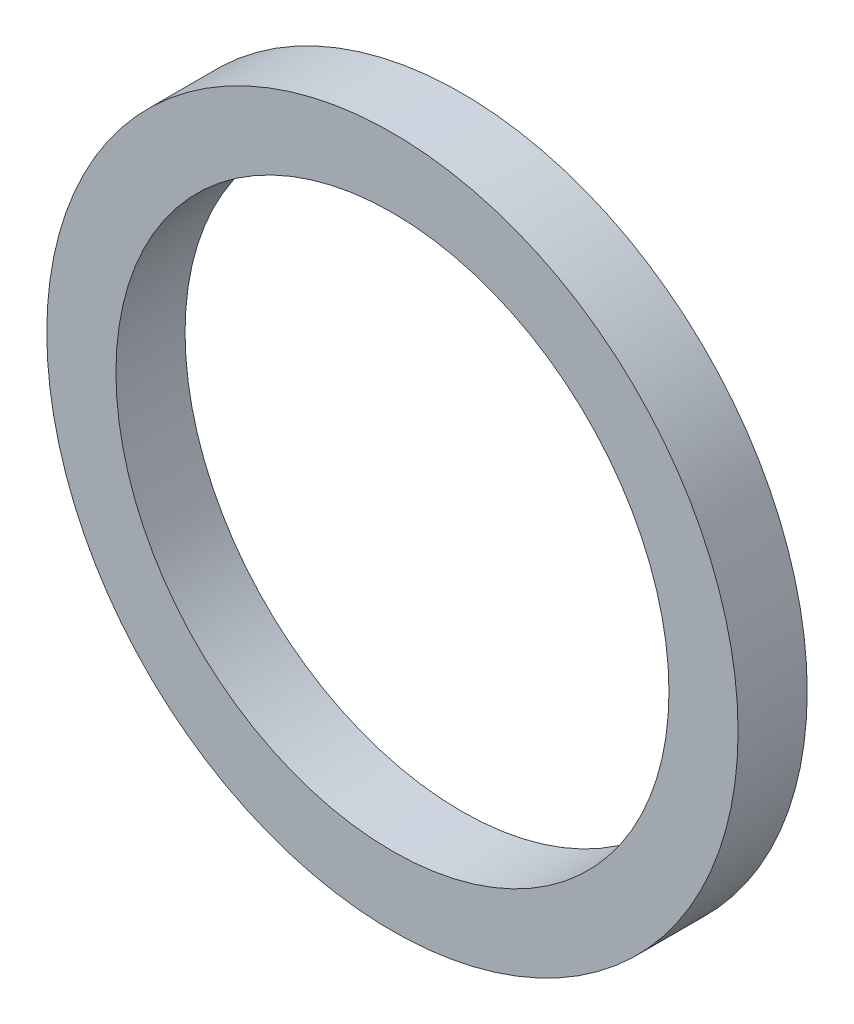
ISO-10303-21;
HEADER;
FILE_DESCRIPTION(('STEP AP214'),'2;1');
FILE_NAME('part.step','',(''),(''),'','','');
FILE_SCHEMA(('AUTOMOTIVE_DESIGN { 1 0 10303 214 1 1 1 1 }'));
ENDSEC;
DATA;
#1=APPLICATION_CONTEXT('core data for automotive mechanical design processes');
#2=APPLICATION_PROTOCOL_DEFINITION('international standard','automotive_design',2000,#1);
#3=PRODUCT_CONTEXT('',#1,'mechanical');
#4=PRODUCT('Part','Part','',(#3));
#5=PRODUCT_RELATED_PRODUCT_CATEGORY('part','',(#4));
#6=PRODUCT_DEFINITION_FORMATION('','',#4);
#7=PRODUCT_DEFINITION_CONTEXT('part definition',#1,'design');
#8=PRODUCT_DEFINITION('design','',#6,#7);
#9=PRODUCT_DEFINITION_SHAPE('','',#8);
#10=(LENGTH_UNIT() NAMED_UNIT(*) SI_UNIT(.MILLI.,.METRE.));
#11=(NAMED_UNIT(*) PLANE_ANGLE_UNIT() SI_UNIT($,.RADIAN.));
#12=(NAMED_UNIT(*) SI_UNIT($,.STERADIAN.) SOLID_ANGLE_UNIT());
#13=UNCERTAINTY_MEASURE_WITH_UNIT(LENGTH_MEASURE(1.E-05),#10,'distance_accuracy_value','');
#14=(GEOMETRIC_REPRESENTATION_CONTEXT(3) GLOBAL_UNCERTAINTY_ASSIGNED_CONTEXT((#13)) GLOBAL_UNIT_ASSIGNED_CONTEXT((#10,
#11,#12)) REPRESENTATION_CONTEXT('',''));
#15=CARTESIAN_POINT('',(0.,0.,0.));
#16=DIRECTION('',(0.,0.,1.));
#17=DIRECTION('',(1.,0.,0.));
#18=AXIS2_PLACEMENT_3D('',#15,#16,#17);
#19=CARTESIAN_POINT('',(0.,0.,15.));
#20=DIRECTION('',(0.,0.,1.));
#21=DIRECTION('',(1.,0.,0.));
#22=AXIS2_PLACEMENT_3D('',#19,#20,#21);
#23=PLANE('',#22);
#24=CARTESIAN_POINT('',(0.,0.,15.));
#25=DIRECTION('',(0.,0.,1.));
#26=DIRECTION('',(1.,0.,0.));
#27=AXIS2_PLACEMENT_3D('',#24,#25,#26);
#28=CIRCLE('',#27,75.);
#29=CARTESIAN_POINT('',(75.,0.,15.));
#30=VERTEX_POINT('',#29);
#31=EDGE_CURVE('E10',#30,#30,#28,.T.);
#32=ORIENTED_EDGE('',*,*,#31,.T.);
#33=EDGE_LOOP('',(#32));
#34=FACE_BOUND('',#33,.T.);
#35=CARTESIAN_POINT('',(0.,0.,15.));
#36=DIRECTION('',(0.,0.,1.));
#37=DIRECTION('',(1.,0.,0.));
#38=AXIS2_PLACEMENT_3D('',#35,#36,#37);
#39=CIRCLE('',#38,60.);
#40=CARTESIAN_POINT('',(60.,0.,15.));
#41=VERTEX_POINT('',#40);
#42=EDGE_CURVE('E50',#41,#41,#39,.T.);
#43=ORIENTED_EDGE('',*,*,#42,.F.);
#44=EDGE_LOOP('',(#43));
#45=FACE_BOUND('',#44,.T.);
#46=ADVANCED_FACE('F39',(#34,#45),#23,.T.);
#47=CARTESIAN_POINT('',(0.,0.,0.));
#48=DIRECTION('',(0.,0.,1.));
#49=DIRECTION('',(1.,0.,0.));
#50=AXIS2_PLACEMENT_3D('',#47,#48,#49);
#51=PLANE('',#50);
#52=CARTESIAN_POINT('',(0.,0.,0.));
#53=DIRECTION('',(0.,0.,1.));
#54=DIRECTION('',(1.,0.,0.));
#55=AXIS2_PLACEMENT_3D('',#52,#53,#54);
#56=CIRCLE('',#55,75.);
#57=CARTESIAN_POINT('',(75.,0.,0.));
#58=VERTEX_POINT('',#57);
#59=EDGE_CURVE('E43',#58,#58,#56,.T.);
#60=ORIENTED_EDGE('',*,*,#59,.F.);
#61=EDGE_LOOP('',(#60));
#62=FACE_BOUND('',#61,.T.);
#63=CARTESIAN_POINT('',(0.,0.,0.));
#64=DIRECTION('',(0.,0.,1.));
#65=DIRECTION('',(1.,0.,0.));
#66=AXIS2_PLACEMENT_3D('',#63,#64,#65);
#67=CIRCLE('',#66,60.);
#68=CARTESIAN_POINT('',(60.,0.,0.));
#69=VERTEX_POINT('',#68);
#70=EDGE_CURVE('E52',#69,#69,#67,.T.);
#71=ORIENTED_EDGE('',*,*,#70,.T.);
#72=EDGE_LOOP('',(#71));
#73=FACE_BOUND('',#72,.T.);
#74=ADVANCED_FACE('F62',(#62,#73),#51,.F.);
#75=CARTESIAN_POINT('',(0.,0.,15.));
#76=DIRECTION('',(0.,0.,-1.));
#77=DIRECTION('',(-1.,0.,0.));
#78=AXIS2_PLACEMENT_3D('',#75,#76,#77);
#79=CYLINDRICAL_SURFACE('',#78,75.);
#80=ORIENTED_EDGE('',*,*,#31,.F.);
#81=EDGE_LOOP('',(#80));
#82=FACE_BOUND('',#81,.T.);
#83=ORIENTED_EDGE('',*,*,#59,.T.);
#84=EDGE_LOOP('',(#83));
#85=FACE_BOUND('',#84,.T.);
#86=ADVANCED_FACE('F41',(#82,#85),#79,.T.);
#87=CARTESIAN_POINT('',(0.,0.,15.));
#88=DIRECTION('',(0.,0.,-1.));
#89=DIRECTION('',(-1.,0.,0.));
#90=AXIS2_PLACEMENT_3D('',#87,#88,#89);
#91=CYLINDRICAL_SURFACE('',#90,60.);
#92=ORIENTED_EDGE('',*,*,#42,.T.);
#93=EDGE_LOOP('',(#92));
#94=FACE_BOUND('',#93,.T.);
#95=ORIENTED_EDGE('',*,*,#70,.F.);
#96=EDGE_LOOP('',(#95));
#97=FACE_BOUND('',#96,.T.);
#98=ADVANCED_FACE('F58',(#94,#97),#91,.F.);
#99=CLOSED_SHELL('',(#46,#74,#86,#98));
#100=MANIFOLD_SOLID_BREP('B2',#99);
#101=ADVANCED_BREP_SHAPE_REPRESENTATION('',(#18,#100),#14);
#102=SHAPE_DEFINITION_REPRESENTATION(#9,#101);
ENDSEC;
END-ISO-10303-21;
